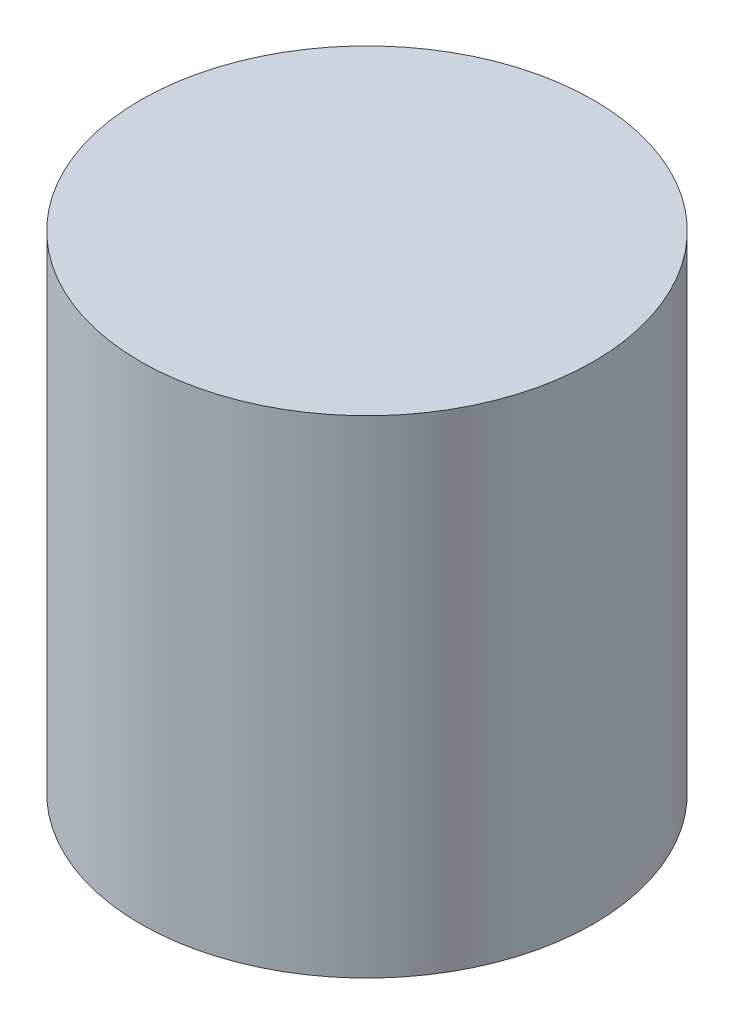
ISO-10303-21;
HEADER;
FILE_DESCRIPTION(('STEP AP214'),'2;1');
FILE_NAME('part.step','',(''),(''),'','','');
FILE_SCHEMA(('AUTOMOTIVE_DESIGN { 1 0 10303 214 1 1 1 1 }'));
ENDSEC;
DATA;
#1=APPLICATION_CONTEXT('core data for automotive mechanical design processes');
#2=APPLICATION_PROTOCOL_DEFINITION('international standard','automotive_design',2000,#1);
#3=PRODUCT_CONTEXT('',#1,'mechanical');
#4=PRODUCT('Part','Part','',(#3));
#5=PRODUCT_RELATED_PRODUCT_CATEGORY('part','',(#4));
#6=PRODUCT_DEFINITION_FORMATION('','',#4);
#7=PRODUCT_DEFINITION_CONTEXT('part definition',#1,'design');
#8=PRODUCT_DEFINITION('design','',#6,#7);
#9=PRODUCT_DEFINITION_SHAPE('','',#8);
#10=(LENGTH_UNIT() NAMED_UNIT(*) SI_UNIT(.MILLI.,.METRE.));
#11=(NAMED_UNIT(*) PLANE_ANGLE_UNIT() SI_UNIT($,.RADIAN.));
#12=(NAMED_UNIT(*) SI_UNIT($,.STERADIAN.) SOLID_ANGLE_UNIT());
#13=UNCERTAINTY_MEASURE_WITH_UNIT(LENGTH_MEASURE(1.E-05),#10,'distance_accuracy_value','');
#14=(GEOMETRIC_REPRESENTATION_CONTEXT(3) GLOBAL_UNCERTAINTY_ASSIGNED_CONTEXT((#13)) GLOBAL_UNIT_ASSIGNED_CONTEXT((#10,
#11,#12)) REPRESENTATION_CONTEXT('',''));
#15=CARTESIAN_POINT('',(0.,0.,0.));
#16=DIRECTION('',(0.,0.,1.));
#17=DIRECTION('',(1.,0.,0.));
#18=AXIS2_PLACEMENT_3D('',#15,#16,#17);
#19=CARTESIAN_POINT('',(0.,21.844,0.));
#20=DIRECTION('',(0.,-1.,0.));
#21=DIRECTION('',(0.,0.,-1.));
#22=AXIS2_PLACEMENT_3D('',#19,#20,#21);
#23=CYLINDRICAL_SURFACE('',#22,10.16);
#24=CARTESIAN_POINT('',(0.,21.844,0.));
#25=DIRECTION('',(0.,1.,0.));
#26=DIRECTION('',(0.,0.,1.));
#27=AXIS2_PLACEMENT_3D('',#24,#25,#26);
#28=CIRCLE('',#27,10.16);
#29=CARTESIAN_POINT('',(0.,21.844,10.16));
#30=VERTEX_POINT('',#29);
#31=EDGE_CURVE('E10',#30,#30,#28,.T.);
#32=ORIENTED_EDGE('',*,*,#31,.F.);
#33=EDGE_LOOP('',(#32));
#34=FACE_BOUND('',#33,.T.);
#35=CARTESIAN_POINT('',(0.,0.,0.));
#36=DIRECTION('',(0.,1.,0.));
#37=DIRECTION('',(0.,0.,1.));
#38=AXIS2_PLACEMENT_3D('',#35,#36,#37);
#39=CIRCLE('',#38,10.16);
#40=CARTESIAN_POINT('',(0.,0.,10.16));
#41=VERTEX_POINT('',#40);
#42=EDGE_CURVE('E33',#41,#41,#39,.T.);
#43=ORIENTED_EDGE('',*,*,#42,.T.);
#44=EDGE_LOOP('',(#43));
#45=FACE_BOUND('',#44,.T.);
#46=ADVANCED_FACE('F30',(#34,#45),#23,.T.);
#47=CARTESIAN_POINT('',(0.,21.844,0.));
#48=DIRECTION('',(0.,1.,0.));
#49=DIRECTION('',(0.,0.,1.));
#50=AXIS2_PLACEMENT_3D('',#47,#48,#49);
#51=PLANE('',#50);
#52=ORIENTED_EDGE('',*,*,#31,.T.);
#53=EDGE_LOOP('',(#52));
#54=FACE_BOUND('',#53,.T.);
#55=ADVANCED_FACE('F45',(#54),#51,.T.);
#56=CARTESIAN_POINT('',(0.,0.,0.));
#57=DIRECTION('',(0.,1.,0.));
#58=DIRECTION('',(0.,0.,1.));
#59=AXIS2_PLACEMENT_3D('',#56,#57,#58);
#60=PLANE('',#59);
#61=ORIENTED_EDGE('',*,*,#42,.F.);
#62=EDGE_LOOP('',(#61));
#63=FACE_BOUND('',#62,.T.);
#64=ADVANCED_FACE('F43',(#63),#60,.F.);
#65=CLOSED_SHELL('',(#46,#55,#64));
#66=MANIFOLD_SOLID_BREP('B2',#65);
#67=ADVANCED_BREP_SHAPE_REPRESENTATION('',(#18,#66),#14);
#68=SHAPE_DEFINITION_REPRESENTATION(#9,#67);
ENDSEC;
END-ISO-10303-21;
